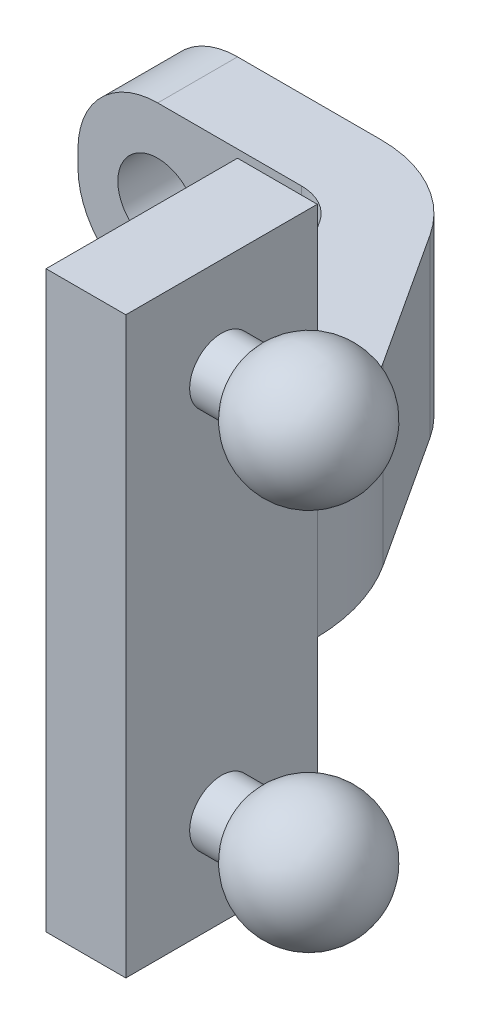
ISO-10303-21;
HEADER;
FILE_DESCRIPTION(('STEP AP214'),'2;1');
FILE_NAME('part.step','',(''),(''),'','','');
FILE_SCHEMA(('AUTOMOTIVE_DESIGN { 1 0 10303 214 1 1 1 1 }'));
ENDSEC;
DATA;
#1=APPLICATION_CONTEXT('core data for automotive mechanical design processes');
#2=APPLICATION_PROTOCOL_DEFINITION('international standard','automotive_design',2000,#1);
#3=PRODUCT_CONTEXT('',#1,'mechanical');
#4=PRODUCT('Part','Part','',(#3));
#5=PRODUCT_RELATED_PRODUCT_CATEGORY('part','',(#4));
#6=PRODUCT_DEFINITION_FORMATION('','',#4);
#7=PRODUCT_DEFINITION_CONTEXT('part definition',#1,'design');
#8=PRODUCT_DEFINITION('design','',#6,#7);
#9=PRODUCT_DEFINITION_SHAPE('','',#8);
#10=(LENGTH_UNIT() NAMED_UNIT(*) SI_UNIT(.MILLI.,.METRE.));
#11=(NAMED_UNIT(*) PLANE_ANGLE_UNIT() SI_UNIT($,.RADIAN.));
#12=(NAMED_UNIT(*) SI_UNIT($,.STERADIAN.) SOLID_ANGLE_UNIT());
#13=UNCERTAINTY_MEASURE_WITH_UNIT(LENGTH_MEASURE(1.E-05),#10,'distance_accuracy_value','');
#14=(GEOMETRIC_REPRESENTATION_CONTEXT(3) GLOBAL_UNCERTAINTY_ASSIGNED_CONTEXT((#13)) GLOBAL_UNIT_ASSIGNED_CONTEXT((#10,
#11,#12)) REPRESENTATION_CONTEXT('',''));
#15=CARTESIAN_POINT('',(0.,0.,0.));
#16=DIRECTION('',(0.,0.,1.));
#17=DIRECTION('',(1.,0.,0.));
#18=AXIS2_PLACEMENT_3D('',#15,#16,#17);
#19=CARTESIAN_POINT('',(0.,2.75,0.));
#20=DIRECTION('',(1.,0.,0.));
#21=DIRECTION('',(0.,0.,-1.));
#22=AXIS2_PLACEMENT_3D('',#19,#20,#21);
#23=PLANE('',#22);
#24=DIRECTION('',(0.,-1.,0.));
#25=VECTOR('',#24,1.);
#26=CARTESIAN_POINT('',(0.,2.75,0.));
#27=LINE('',#26,#25);
#28=CARTESIAN_POINT('',(0.,0.25,0.));
#29=VERTEX_POINT('',#28);
#30=CARTESIAN_POINT('',(0.,-0.25,0.));
#31=VERTEX_POINT('',#30);
#32=EDGE_CURVE('E244',#29,#31,#27,.T.);
#33=ORIENTED_EDGE('',*,*,#32,.T.);
#34=DIRECTION('',(0.,0.,1.));
#35=VECTOR('',#34,1.);
#36=CARTESIAN_POINT('',(0.,-0.25,2.5));
#37=LINE('',#36,#35);
#38=CARTESIAN_POINT('',(0.,-0.25,2.5));
#39=VERTEX_POINT('',#38);
#40=EDGE_CURVE('E287',#31,#39,#37,.T.);
#41=ORIENTED_EDGE('',*,*,#40,.T.);
#42=DIRECTION('',(0.,-1.,0.));
#43=VECTOR('',#42,1.);
#44=CARTESIAN_POINT('',(0.,2.75,2.5));
#45=LINE('',#44,#43);
#46=CARTESIAN_POINT('',(0.,0.25,2.5));
#47=VERTEX_POINT('',#46);
#48=EDGE_CURVE('E282',#47,#39,#45,.T.);
#49=ORIENTED_EDGE('',*,*,#48,.F.);
#50=DIRECTION('',(0.,0.,1.));
#51=VECTOR('',#50,1.);
#52=CARTESIAN_POINT('',(0.,0.25,0.));
#53=LINE('',#52,#51);
#54=EDGE_CURVE('E285',#47,#29,#53,.F.);
#55=ORIENTED_EDGE('',*,*,#54,.T.);
#56=EDGE_LOOP('',(#33,#41,#49,#55));
#57=FACE_BOUND('',#56,.T.);
#58=ADVANCED_FACE('F39',(#57),#23,.F.);
#59=CARTESIAN_POINT('',(0.,2.75,2.5));
#60=DIRECTION('',(0.,0.,-1.));
#61=DIRECTION('',(-1.,0.,0.));
#62=AXIS2_PLACEMENT_3D('',#59,#60,#61);
#63=PLANE('',#62);
#64=CARTESIAN_POINT('',(2.5,0.,2.5));
#65=DIRECTION('',(0.,0.,-1.));
#66=DIRECTION('',(-1.,0.,0.));
#67=AXIS2_PLACEMENT_3D('',#64,#65,#66);
#68=CIRCLE('',#67,1.25);
#69=CARTESIAN_POINT('',(1.25,0.,2.5));
#70=VERTEX_POINT('',#69);
#71=EDGE_CURVE('E222',#70,#70,#68,.T.);
#72=ORIENTED_EDGE('',*,*,#71,.T.);
#73=EDGE_LOOP('',(#72));
#74=FACE_BOUND('',#73,.T.);
#75=ORIENTED_EDGE('',*,*,#48,.T.);
#76=CARTESIAN_POINT('',(2.5,-0.25,2.5));
#77=DIRECTION('',(0.,0.,-1.));
#78=DIRECTION('',(-1.,0.,0.));
#79=AXIS2_PLACEMENT_3D('',#76,#77,#78);
#80=CIRCLE('',#79,2.5);
#81=CARTESIAN_POINT('',(2.5,-2.75,2.5));
#82=VERTEX_POINT('',#81);
#83=EDGE_CURVE('E292',#39,#82,#80,.F.);
#84=ORIENTED_EDGE('',*,*,#83,.T.);
#85=DIRECTION('',(1.,0.,0.));
#86=VECTOR('',#85,1.);
#87=CARTESIAN_POINT('',(0.,-2.75,2.5));
#88=LINE('',#87,#86);
#89=CARTESIAN_POINT('',(7.,-2.75,2.5));
#90=VERTEX_POINT('',#89);
#91=EDGE_CURVE('E225',#82,#90,#88,.T.);
#92=ORIENTED_EDGE('',*,*,#91,.T.);
#93=DIRECTION('',(0.,-1.,0.));
#94=VECTOR('',#93,1.);
#95=CARTESIAN_POINT('',(7.,2.75,2.5));
#96=LINE('',#95,#94);
#97=CARTESIAN_POINT('',(7.,2.75,2.5));
#98=VERTEX_POINT('',#97);
#99=EDGE_CURVE('E279',#98,#90,#96,.T.);
#100=ORIENTED_EDGE('',*,*,#99,.F.);
#101=DIRECTION('',(1.,0.,0.));
#102=VECTOR('',#101,1.);
#103=CARTESIAN_POINT('',(0.,2.75,2.5));
#104=LINE('',#103,#102);
#105=CARTESIAN_POINT('',(2.5,2.75,2.5));
#106=VERTEX_POINT('',#105);
#107=EDGE_CURVE('E226',#106,#98,#104,.T.);
#108=ORIENTED_EDGE('',*,*,#107,.F.);
#109=CARTESIAN_POINT('',(2.5,0.25,2.5));
#110=DIRECTION('',(0.,0.,-1.));
#111=DIRECTION('',(-1.,0.,0.));
#112=AXIS2_PLACEMENT_3D('',#109,#110,#111);
#113=CIRCLE('',#112,2.5);
#114=EDGE_CURVE('E290',#106,#47,#113,.F.);
#115=ORIENTED_EDGE('',*,*,#114,.T.);
#116=EDGE_LOOP('',(#75,#84,#92,#100,#108,#115));
#117=FACE_BOUND('',#116,.T.);
#118=ADVANCED_FACE('F376',(#74,#117),#63,.F.);
#119=CARTESIAN_POINT('',(7.,2.75,4.));
#120=DIRECTION('',(0.,-1.,0.));
#121=DIRECTION('',(0.,0.,-1.));
#122=AXIS2_PLACEMENT_3D('',#119,#120,#121);
#123=CYLINDRICAL_SURFACE('',#122,1.5);
#124=CARTESIAN_POINT('',(7.,-2.75,4.));
#125=DIRECTION('',(0.,-1.,0.));
#126=DIRECTION('',(0.,0.,-1.));
#127=AXIS2_PLACEMENT_3D('',#124,#125,#126);
#128=CIRCLE('',#127,1.5);
#129=CARTESIAN_POINT('',(8.25754577081105,-2.75,3.18233342106012));
#130=VERTEX_POINT('',#129);
#131=EDGE_CURVE('E246',#90,#130,#128,.T.);
#132=ORIENTED_EDGE('',*,*,#131,.T.);
#133=DIRECTION('',(0.,-1.,0.));
#134=VECTOR('',#133,1.);
#135=CARTESIAN_POINT('',(8.25754577081105,2.75,3.18233342106012));
#136=LINE('',#135,#134);
#137=CARTESIAN_POINT('',(8.25754577081105,2.75,3.18233342106012));
#138=VERTEX_POINT('',#137);
#139=EDGE_CURVE('E276',#138,#130,#136,.T.);
#140=ORIENTED_EDGE('',*,*,#139,.F.);
#141=CARTESIAN_POINT('',(7.,2.75,4.));
#142=DIRECTION('',(0.,-1.,0.));
#143=DIRECTION('',(0.,0.,-1.));
#144=AXIS2_PLACEMENT_3D('',#141,#142,#143);
#145=CIRCLE('',#144,1.5);
#146=EDGE_CURVE('E228',#98,#138,#145,.T.);
#147=ORIENTED_EDGE('',*,*,#146,.F.);
#148=ORIENTED_EDGE('',*,*,#99,.T.);
#149=EDGE_LOOP('',(#132,#140,#147,#148));
#150=FACE_BOUND('',#149,.T.);
#151=ADVANCED_FACE('F383',(#150),#123,.F.);
#152=CARTESIAN_POINT('',(8.25754577081105,2.75,3.18233342106012));
#153=DIRECTION('',(0.838363847207363,0.,-0.54511105262659));
#154=DIRECTION('',(-0.54511105262659,0.,-0.838363847207363));
#155=AXIS2_PLACEMENT_3D('',#152,#153,#154);
#156=PLANE('',#155);
#157=DIRECTION('',(0.54511105262659,0.,0.838363847207363));
#158=VECTOR('',#157,1.);
#159=CARTESIAN_POINT('',(8.25754577081105,-2.75,3.18233342106012));
#160=LINE('',#159,#158);
#161=CARTESIAN_POINT('',(10.9902966016318,-2.75,7.38521921643481));
#162=VERTEX_POINT('',#161);
#163=EDGE_CURVE('E248',#130,#162,#160,.T.);
#164=ORIENTED_EDGE('',*,*,#163,.T.);
#165=DIRECTION('',(0.,-1.,0.));
#166=VECTOR('',#165,1.);
#167=CARTESIAN_POINT('',(10.9902966016318,2.75,7.38521921643481));
#168=LINE('',#167,#166);
#169=CARTESIAN_POINT('',(10.9902966016318,2.75,7.38521921643481));
#170=VERTEX_POINT('',#169);
#171=EDGE_CURVE('E273',#170,#162,#168,.T.);
#172=ORIENTED_EDGE('',*,*,#171,.F.);
#173=DIRECTION('',(0.54511105262659,0.,0.838363847207363));
#174=VECTOR('',#173,1.);
#175=CARTESIAN_POINT('',(8.25754577081105,2.75,3.18233342106012));
#176=LINE('',#175,#174);
#177=EDGE_CURVE('E231',#138,#170,#176,.T.);
#178=ORIENTED_EDGE('',*,*,#177,.F.);
#179=ORIENTED_EDGE('',*,*,#139,.T.);
#180=EDGE_LOOP('',(#164,#172,#178,#179));
#181=FACE_BOUND('',#180,.T.);
#182=ADVANCED_FACE('F410',(#181),#156,.F.);
#183=CARTESIAN_POINT('',(8.34660028365028,2.75,9.10417225516659));
#184=DIRECTION('',(0.,-1.,0.));
#185=DIRECTION('',(0.,0.,-1.));
#186=AXIS2_PLACEMENT_3D('',#183,#184,#185);
#187=CYLINDRICAL_SURFACE('',#186,3.15339971634972);
#188=CARTESIAN_POINT('',(8.34660028365028,-2.75,9.10417225516659));
#189=DIRECTION('',(0.,-1.,0.));
#190=DIRECTION('',(0.,0.,1.));
#191=AXIS2_PLACEMENT_3D('',#188,#189,#190);
#192=CIRCLE('',#191,3.15339971634972);
#193=CARTESIAN_POINT('',(11.5,-2.75,9.10417225516659));
#194=VERTEX_POINT('',#193);
#195=EDGE_CURVE('E250',#162,#194,#192,.T.);
#196=ORIENTED_EDGE('',*,*,#195,.T.);
#197=DIRECTION('',(0.,-1.,0.));
#198=VECTOR('',#197,1.);
#199=CARTESIAN_POINT('',(11.5,2.75,9.10417225516659));
#200=LINE('',#199,#198);
#201=CARTESIAN_POINT('',(11.5,2.75,9.10417225516659));
#202=VERTEX_POINT('',#201);
#203=EDGE_CURVE('E174',#202,#194,#200,.T.);
#204=ORIENTED_EDGE('',*,*,#203,.F.);
#205=CARTESIAN_POINT('',(8.34660028365028,2.75,9.10417225516659));
#206=DIRECTION('',(0.,-1.,0.));
#207=DIRECTION('',(0.,0.,1.));
#208=AXIS2_PLACEMENT_3D('',#205,#206,#207);
#209=CIRCLE('',#208,3.15339971634972);
#210=EDGE_CURVE('E233',#170,#202,#209,.T.);
#211=ORIENTED_EDGE('',*,*,#210,.F.);
#212=ORIENTED_EDGE('',*,*,#171,.T.);
#213=EDGE_LOOP('',(#196,#204,#211,#212));
#214=FACE_BOUND('',#213,.T.);
#215=ADVANCED_FACE('F330',(#214),#187,.F.);
#216=CARTESIAN_POINT('',(11.5,2.75,9.10417225516659));
#217=DIRECTION('',(1.,0.,0.));
#218=DIRECTION('',(0.,0.,-1.));
#219=AXIS2_PLACEMENT_3D('',#216,#217,#218);
#220=PLANE('',#219);
#221=ORIENTED_EDGE('',*,*,#203,.T.);
#222=DIRECTION('',(0.,0.,-1.));
#223=VECTOR('',#222,1.);
#224=CARTESIAN_POINT('',(11.5,-2.75,4.));
#225=LINE('',#224,#223);
#226=CARTESIAN_POINT('',(11.5,-2.75,9.));
#227=VERTEX_POINT('',#226);
#228=EDGE_CURVE('E301',#194,#227,#225,.T.);
#229=ORIENTED_EDGE('',*,*,#228,.T.);
#230=DIRECTION('',(0.,-1.,0.));
#231=VECTOR('',#230,1.);
#232=CARTESIAN_POINT('',(11.5,8.99999999999999,9.));
#233=LINE('',#232,#231);
#234=CARTESIAN_POINT('',(11.5,-9.,9.));
#235=VERTEX_POINT('',#234);
#236=EDGE_CURVE('E188',#227,#235,#233,.T.);
#237=ORIENTED_EDGE('',*,*,#236,.T.);
#238=DIRECTION('',(0.,0.,1.));
#239=VECTOR('',#238,1.);
#240=CARTESIAN_POINT('',(11.5,-9.,9.));
#241=LINE('',#240,#239);
#242=CARTESIAN_POINT('',(11.5,-9.,15.));
#243=VERTEX_POINT('',#242);
#244=EDGE_CURVE('E170',#235,#243,#241,.T.);
#245=ORIENTED_EDGE('',*,*,#244,.T.);
#246=DIRECTION('',(0.,-1.,0.));
#247=VECTOR('',#246,1.);
#248=CARTESIAN_POINT('',(11.5,2.75,15.));
#249=LINE('',#248,#247);
#250=CARTESIAN_POINT('',(11.5,9.,15.));
#251=VERTEX_POINT('',#250);
#252=EDGE_CURVE('E162',#251,#243,#249,.T.);
#253=ORIENTED_EDGE('',*,*,#252,.F.);
#254=DIRECTION('',(0.,0.,-1.));
#255=VECTOR('',#254,1.);
#256=CARTESIAN_POINT('',(11.5,8.99999999999999,9.));
#257=LINE('',#256,#255);
#258=CARTESIAN_POINT('',(11.5,8.99999999999999,9.));
#259=VERTEX_POINT('',#258);
#260=EDGE_CURVE('E168',#251,#259,#257,.T.);
#261=ORIENTED_EDGE('',*,*,#260,.T.);
#262=CARTESIAN_POINT('',(11.5,2.75,9.));
#263=VERTEX_POINT('',#262);
#264=EDGE_CURVE('E191',#259,#263,#233,.T.);
#265=ORIENTED_EDGE('',*,*,#264,.T.);
#266=DIRECTION('',(0.,0.,-1.));
#267=VECTOR('',#266,1.);
#268=CARTESIAN_POINT('',(11.5,2.75,4.));
#269=LINE('',#268,#267);
#270=EDGE_CURVE('E210',#202,#263,#269,.T.);
#271=ORIENTED_EDGE('',*,*,#270,.F.);
#272=EDGE_LOOP('',(#221,#229,#237,#245,#253,#261,#265,#271));
#273=FACE_BOUND('',#272,.T.);
#274=ADVANCED_FACE('F165',(#273),#220,.F.);
#275=CARTESIAN_POINT('',(11.5,2.75,15.));
#276=DIRECTION('',(0.,0.,-1.));
#277=DIRECTION('',(-1.,0.,0.));
#278=AXIS2_PLACEMENT_3D('',#275,#276,#277);
#279=PLANE('',#278);
#280=ORIENTED_EDGE('',*,*,#252,.T.);
#281=DIRECTION('',(-1.,0.,0.));
#282=VECTOR('',#281,1.);
#283=CARTESIAN_POINT('',(32.9736659610103,-9.,15.));
#284=LINE('',#283,#282);
#285=CARTESIAN_POINT('',(14.,-9.,15.));
#286=VERTEX_POINT('',#285);
#287=EDGE_CURVE('E201',#286,#243,#284,.T.);
#288=ORIENTED_EDGE('',*,*,#287,.F.);
#289=DIRECTION('',(0.,-1.,0.));
#290=VECTOR('',#289,1.);
#291=CARTESIAN_POINT('',(14.,2.75,15.));
#292=LINE('',#291,#290);
#293=CARTESIAN_POINT('',(14.,9.,15.));
#294=VERTEX_POINT('',#293);
#295=EDGE_CURVE('E175',#294,#286,#292,.T.);
#296=ORIENTED_EDGE('',*,*,#295,.F.);
#297=DIRECTION('',(-1.,0.,0.));
#298=VECTOR('',#297,1.);
#299=CARTESIAN_POINT('',(32.9736659610103,9.,15.));
#300=LINE('',#299,#298);
#301=EDGE_CURVE('E178',#294,#251,#300,.T.);
#302=ORIENTED_EDGE('',*,*,#301,.T.);
#303=EDGE_LOOP('',(#280,#288,#296,#302));
#304=FACE_BOUND('',#303,.T.);
#305=ADVANCED_FACE('F179',(#304),#279,.F.);
#306=CARTESIAN_POINT('',(14.,2.75,9.10417225516659));
#307=DIRECTION('',(-1.,0.,0.));
#308=DIRECTION('',(0.,0.,1.));
#309=AXIS2_PLACEMENT_3D('',#306,#307,#308);
#310=PLANE('',#309);
#311=CARTESIAN_POINT('',(14.,-5.99999999999999,12.));
#312=DIRECTION('',(-1.,0.,0.));
#313=DIRECTION('',(0.,0.,-1.));
#314=AXIS2_PLACEMENT_3D('',#311,#312,#313);
#315=CIRCLE('',#314,1.);
#316=CARTESIAN_POINT('',(14.,-5.99999999999999,11.));
#317=VERTEX_POINT('',#316);
#318=EDGE_CURVE('E194',#317,#317,#315,.T.);
#319=ORIENTED_EDGE('',*,*,#318,.T.);
#320=EDGE_LOOP('',(#319));
#321=FACE_BOUND('',#320,.T.);
#322=CARTESIAN_POINT('',(14.,5.99999999999999,12.));
#323=DIRECTION('',(-1.,0.,0.));
#324=DIRECTION('',(0.,0.,1.));
#325=AXIS2_PLACEMENT_3D('',#322,#323,#324);
#326=CIRCLE('',#325,1.);
#327=CARTESIAN_POINT('',(14.,5.99999999999999,13.));
#328=VERTEX_POINT('',#327);
#329=EDGE_CURVE('E11',#328,#328,#326,.F.);
#330=ORIENTED_EDGE('',*,*,#329,.F.);
#331=EDGE_LOOP('',(#330));
#332=FACE_BOUND('',#331,.T.);
#333=ORIENTED_EDGE('',*,*,#295,.T.);
#334=DIRECTION('',(0.,0.,-1.));
#335=VECTOR('',#334,1.);
#336=CARTESIAN_POINT('',(14.,-9.,8.99999999999999));
#337=LINE('',#336,#335);
#338=CARTESIAN_POINT('',(14.,-9.,9.));
#339=VERTEX_POINT('',#338);
#340=EDGE_CURVE('E197',#286,#339,#337,.T.);
#341=ORIENTED_EDGE('',*,*,#340,.T.);
#342=DIRECTION('',(0.,1.,0.));
#343=VECTOR('',#342,1.);
#344=CARTESIAN_POINT('',(14.,8.99999999999999,9.));
#345=LINE('',#344,#343);
#346=CARTESIAN_POINT('',(14.,8.99999999999999,9.));
#347=VERTEX_POINT('',#346);
#348=EDGE_CURVE('E203',#339,#347,#345,.T.);
#349=ORIENTED_EDGE('',*,*,#348,.T.);
#350=DIRECTION('',(0.,0.,1.));
#351=VECTOR('',#350,1.);
#352=CARTESIAN_POINT('',(14.,8.99999999999999,8.99999999999999));
#353=LINE('',#352,#351);
#354=EDGE_CURVE('E208',#347,#294,#353,.T.);
#355=ORIENTED_EDGE('',*,*,#354,.T.);
#356=EDGE_LOOP('',(#333,#341,#349,#355));
#357=FACE_BOUND('',#356,.T.);
#358=ADVANCED_FACE('F356',(#321,#332,#357),#310,.F.);
#359=CARTESIAN_POINT('',(8.34660028365028,2.75,9.10417225516659));
#360=DIRECTION('',(0.,-1.,0.));
#361=DIRECTION('',(0.,0.,-1.));
#362=AXIS2_PLACEMENT_3D('',#359,#360,#361);
#363=CYLINDRICAL_SURFACE('',#362,5.65339971634972);
#364=CARTESIAN_POINT('',(8.34660028365028,2.75,9.10417225516659));
#365=DIRECTION('',(0.,1.,0.));
#366=DIRECTION('',(0.,0.,-1.));
#367=AXIS2_PLACEMENT_3D('',#364,#365,#366);
#368=CIRCLE('',#367,5.65339971634972);
#369=CARTESIAN_POINT('',(13.9990401545447,2.75,9.));
#370=VERTEX_POINT('',#369);
#371=CARTESIAN_POINT('',(13.0862062196502,2.75,6.02244158486833));
#372=VERTEX_POINT('',#371);
#373=EDGE_CURVE('E236',#370,#372,#368,.T.);
#374=ORIENTED_EDGE('',*,*,#373,.F.);
#375=DIRECTION('',(0.,-1.,0.));
#376=VECTOR('',#375,1.);
#377=CARTESIAN_POINT('',(13.9990401545447,2.75,9.));
#378=LINE('',#377,#376);
#379=CARTESIAN_POINT('',(13.9990401545447,-2.75,9.));
#380=VERTEX_POINT('',#379);
#381=EDGE_CURVE('E213',#370,#380,#378,.T.);
#382=ORIENTED_EDGE('',*,*,#381,.T.);
#383=CARTESIAN_POINT('',(8.34660028365028,-2.75,9.10417225516659));
#384=DIRECTION('',(0.,1.,0.));
#385=DIRECTION('',(0.,0.,-1.));
#386=AXIS2_PLACEMENT_3D('',#383,#384,#385);
#387=CIRCLE('',#386,5.65339971634972);
#388=CARTESIAN_POINT('',(13.0862062196502,-2.75,6.02244158486833));
#389=VERTEX_POINT('',#388);
#390=EDGE_CURVE('E253',#380,#389,#387,.T.);
#391=ORIENTED_EDGE('',*,*,#390,.T.);
#392=DIRECTION('',(0.,-1.,0.));
#393=VECTOR('',#392,1.);
#394=CARTESIAN_POINT('',(13.0862062196502,2.75,6.02244158486833));
#395=LINE('',#394,#393);
#396=EDGE_CURVE('E268',#372,#389,#395,.T.);
#397=ORIENTED_EDGE('',*,*,#396,.F.);
#398=EDGE_LOOP('',(#374,#382,#391,#397));
#399=FACE_BOUND('',#398,.T.);
#400=ADVANCED_FACE('F309',(#399),#363,.T.);
#401=CARTESIAN_POINT('',(10.3534553888295,2.75,1.81955578949364));
#402=DIRECTION('',(-0.838363847207363,0.,0.54511105262659));
#403=DIRECTION('',(0.54511105262659,0.,0.838363847207363));
#404=AXIS2_PLACEMENT_3D('',#401,#402,#403);
#405=PLANE('',#404);
#406=DIRECTION('',(-0.54511105262659,0.,-0.838363847207363));
#407=VECTOR('',#406,1.);
#408=CARTESIAN_POINT('',(10.3534553888295,-2.75,1.81955578949364));
#409=LINE('',#408,#407);
#410=CARTESIAN_POINT('',(10.3534553888295,-2.75,1.81955578949364));
#411=VERTEX_POINT('',#410);
#412=EDGE_CURVE('E255',#389,#411,#409,.T.);
#413=ORIENTED_EDGE('',*,*,#412,.T.);
#414=DIRECTION('',(0.,-1.,0.));
#415=VECTOR('',#414,1.);
#416=CARTESIAN_POINT('',(10.3534553888295,2.75,1.81955578949364));
#417=LINE('',#416,#415);
#418=CARTESIAN_POINT('',(10.3534553888295,2.75,1.81955578949364));
#419=VERTEX_POINT('',#418);
#420=EDGE_CURVE('E265',#419,#411,#417,.T.);
#421=ORIENTED_EDGE('',*,*,#420,.F.);
#422=DIRECTION('',(-0.54511105262659,0.,-0.838363847207363));
#423=VECTOR('',#422,1.);
#424=CARTESIAN_POINT('',(10.3534553888295,2.75,1.81955578949364));
#425=LINE('',#424,#423);
#426=EDGE_CURVE('E238',#372,#419,#425,.T.);
#427=ORIENTED_EDGE('',*,*,#426,.F.);
#428=ORIENTED_EDGE('',*,*,#396,.T.);
#429=EDGE_LOOP('',(#413,#421,#427,#428));
#430=FACE_BOUND('',#429,.T.);
#431=ADVANCED_FACE('F316',(#430),#405,.F.);
#432=CARTESIAN_POINT('',(7.,2.75,4.));
#433=DIRECTION('',(0.,-1.,0.));
#434=DIRECTION('',(0.,0.,-1.));
#435=AXIS2_PLACEMENT_3D('',#432,#433,#434);
#436=CYLINDRICAL_SURFACE('',#435,4.);
#437=CARTESIAN_POINT('',(7.,-2.75,4.));
#438=DIRECTION('',(0.,1.,0.));
#439=DIRECTION('',(0.,0.,-1.));
#440=AXIS2_PLACEMENT_3D('',#437,#438,#439);
#441=CIRCLE('',#440,4.);
#442=CARTESIAN_POINT('',(7.,-2.75,0.));
#443=VERTEX_POINT('',#442);
#444=EDGE_CURVE('E257',#411,#443,#441,.T.);
#445=ORIENTED_EDGE('',*,*,#444,.T.);
#446=DIRECTION('',(0.,-1.,0.));
#447=VECTOR('',#446,1.);
#448=CARTESIAN_POINT('',(7.,2.75,0.));
#449=LINE('',#448,#447);
#450=CARTESIAN_POINT('',(7.,2.75,0.));
#451=VERTEX_POINT('',#450);
#452=EDGE_CURVE('E262',#451,#443,#449,.T.);
#453=ORIENTED_EDGE('',*,*,#452,.F.);
#454=CARTESIAN_POINT('',(7.,2.75,4.));
#455=DIRECTION('',(0.,1.,0.));
#456=DIRECTION('',(0.,0.,-1.));
#457=AXIS2_PLACEMENT_3D('',#454,#455,#456);
#458=CIRCLE('',#457,4.);
#459=EDGE_CURVE('E240',#419,#451,#458,.T.);
#460=ORIENTED_EDGE('',*,*,#459,.F.);
#461=ORIENTED_EDGE('',*,*,#420,.T.);
#462=EDGE_LOOP('',(#445,#453,#460,#461));
#463=FACE_BOUND('',#462,.T.);
#464=ADVANCED_FACE('F320',(#463),#436,.T.);
#465=CARTESIAN_POINT('',(0.,2.75,0.));
#466=DIRECTION('',(0.,0.,1.));
#467=DIRECTION('',(1.,0.,0.));
#468=AXIS2_PLACEMENT_3D('',#465,#466,#467);
#469=PLANE('',#468);
#470=CARTESIAN_POINT('',(2.5,0.,0.));
#471=DIRECTION('',(0.,0.,-1.));
#472=DIRECTION('',(-1.,0.,0.));
#473=AXIS2_PLACEMENT_3D('',#470,#471,#472);
#474=CIRCLE('',#473,1.25);
#475=CARTESIAN_POINT('',(1.25,0.,0.));
#476=VERTEX_POINT('',#475);
#477=EDGE_CURVE('E219',#476,#476,#474,.T.);
#478=ORIENTED_EDGE('',*,*,#477,.F.);
#479=EDGE_LOOP('',(#478));
#480=FACE_BOUND('',#479,.T.);
#481=DIRECTION('',(-1.,0.,0.));
#482=VECTOR('',#481,1.);
#483=CARTESIAN_POINT('',(0.,-2.75,0.));
#484=LINE('',#483,#482);
#485=CARTESIAN_POINT('',(2.5,-2.75,0.));
#486=VERTEX_POINT('',#485);
#487=EDGE_CURVE('E229',#443,#486,#484,.T.);
#488=ORIENTED_EDGE('',*,*,#487,.T.);
#489=CARTESIAN_POINT('',(2.5,-0.25,0.));
#490=DIRECTION('',(0.,0.,1.));
#491=DIRECTION('',(1.,0.,0.));
#492=AXIS2_PLACEMENT_3D('',#489,#490,#491);
#493=CIRCLE('',#492,2.5);
#494=EDGE_CURVE('E296',#486,#31,#493,.F.);
#495=ORIENTED_EDGE('',*,*,#494,.T.);
#496=ORIENTED_EDGE('',*,*,#32,.F.);
#497=CARTESIAN_POINT('',(2.5,0.25,0.));
#498=DIRECTION('',(0.,0.,1.));
#499=DIRECTION('',(1.,0.,0.));
#500=AXIS2_PLACEMENT_3D('',#497,#498,#499);
#501=CIRCLE('',#500,2.5);
#502=CARTESIAN_POINT('',(2.5,2.75,0.));
#503=VERTEX_POINT('',#502);
#504=EDGE_CURVE('E54',#29,#503,#501,.F.);
#505=ORIENTED_EDGE('',*,*,#504,.T.);
#506=DIRECTION('',(-1.,0.,0.));
#507=VECTOR('',#506,1.);
#508=CARTESIAN_POINT('',(0.,2.75,0.));
#509=LINE('',#508,#507);
#510=EDGE_CURVE('E242',#451,#503,#509,.T.);
#511=ORIENTED_EDGE('',*,*,#510,.F.);
#512=ORIENTED_EDGE('',*,*,#452,.T.);
#513=EDGE_LOOP('',(#488,#495,#496,#505,#511,#512));
#514=FACE_BOUND('',#513,.T.);
#515=ADVANCED_FACE('F400',(#480,#514),#469,.F.);
#516=CARTESIAN_POINT('',(7.,2.75,4.));
#517=DIRECTION('',(0.,-1.,0.));
#518=DIRECTION('',(0.,0.,-1.));
#519=AXIS2_PLACEMENT_3D('',#516,#517,#518);
#520=PLANE('',#519);
#521=ORIENTED_EDGE('',*,*,#270,.T.);
#522=DIRECTION('',(1.,0.,0.));
#523=VECTOR('',#522,1.);
#524=CARTESIAN_POINT('',(7.,2.75,9.));
#525=LINE('',#524,#523);
#526=EDGE_CURVE('E216',#263,#370,#525,.T.);
#527=ORIENTED_EDGE('',*,*,#526,.T.);
#528=ORIENTED_EDGE('',*,*,#373,.T.);
#529=ORIENTED_EDGE('',*,*,#426,.T.);
#530=ORIENTED_EDGE('',*,*,#459,.T.);
#531=ORIENTED_EDGE('',*,*,#510,.T.);
#532=DIRECTION('',(0.,0.,1.));
#533=VECTOR('',#532,1.);
#534=CARTESIAN_POINT('',(2.5,2.75,4.));
#535=LINE('',#534,#533);
#536=EDGE_CURVE('E298',#503,#106,#535,.T.);
#537=ORIENTED_EDGE('',*,*,#536,.T.);
#538=ORIENTED_EDGE('',*,*,#107,.T.);
#539=ORIENTED_EDGE('',*,*,#146,.T.);
#540=ORIENTED_EDGE('',*,*,#177,.T.);
#541=ORIENTED_EDGE('',*,*,#210,.T.);
#542=EDGE_LOOP('',(#521,#527,#528,#529,#530,#531,#537,#538,#539,#540,#541));
#543=FACE_BOUND('',#542,.T.);
#544=ADVANCED_FACE('F323',(#543),#520,.F.);
#545=CARTESIAN_POINT('',(7.,-2.75,4.));
#546=DIRECTION('',(0.,-1.,0.));
#547=DIRECTION('',(0.,0.,-1.));
#548=AXIS2_PLACEMENT_3D('',#545,#546,#547);
#549=PLANE('',#548);
#550=DIRECTION('',(1.,0.,0.));
#551=VECTOR('',#550,1.);
#552=CARTESIAN_POINT('',(7.,-2.75,9.00000000000001));
#553=LINE('',#552,#551);
#554=EDGE_CURVE('E47',#227,#380,#553,.T.);
#555=ORIENTED_EDGE('',*,*,#554,.F.);
#556=ORIENTED_EDGE('',*,*,#228,.F.);
#557=ORIENTED_EDGE('',*,*,#195,.F.);
#558=ORIENTED_EDGE('',*,*,#163,.F.);
#559=ORIENTED_EDGE('',*,*,#131,.F.);
#560=ORIENTED_EDGE('',*,*,#91,.F.);
#561=DIRECTION('',(0.,0.,1.));
#562=VECTOR('',#561,1.);
#563=CARTESIAN_POINT('',(2.5,-2.75,0.));
#564=LINE('',#563,#562);
#565=EDGE_CURVE('E62',#82,#486,#564,.F.);
#566=ORIENTED_EDGE('',*,*,#565,.T.);
#567=ORIENTED_EDGE('',*,*,#487,.F.);
#568=ORIENTED_EDGE('',*,*,#444,.F.);
#569=ORIENTED_EDGE('',*,*,#412,.F.);
#570=ORIENTED_EDGE('',*,*,#390,.F.);
#571=EDGE_LOOP('',(#555,#556,#557,#558,#559,#560,#566,#567,#568,#569,#570));
#572=FACE_BOUND('',#571,.T.);
#573=ADVANCED_FACE('F312',(#572),#549,.T.);
#574=CARTESIAN_POINT('',(2.5,0.,10.));
#575=DIRECTION('',(0.,0.,-1.));
#576=DIRECTION('',(-1.,0.,0.));
#577=AXIS2_PLACEMENT_3D('',#574,#575,#576);
#578=CYLINDRICAL_SURFACE('',#577,1.25);
#579=ORIENTED_EDGE('',*,*,#477,.T.);
#580=EDGE_LOOP('',(#579));
#581=FACE_BOUND('',#580,.T.);
#582=ORIENTED_EDGE('',*,*,#71,.F.);
#583=EDGE_LOOP('',(#582));
#584=FACE_BOUND('',#583,.T.);
#585=ADVANCED_FACE('F389',(#581,#584),#578,.F.);
#586=CARTESIAN_POINT('',(2.5,-0.25,0.));
#587=DIRECTION('',(0.,0.,-1.));
#588=DIRECTION('',(-1.,0.,0.));
#589=AXIS2_PLACEMENT_3D('',#586,#587,#588);
#590=CYLINDRICAL_SURFACE('',#589,2.5);
#591=ORIENTED_EDGE('',*,*,#494,.F.);
#592=ORIENTED_EDGE('',*,*,#565,.F.);
#593=ORIENTED_EDGE('',*,*,#83,.F.);
#594=ORIENTED_EDGE('',*,*,#40,.F.);
#595=EDGE_LOOP('',(#591,#592,#593,#594));
#596=FACE_BOUND('',#595,.T.);
#597=ADVANCED_FACE('F387',(#596),#590,.T.);
#598=CARTESIAN_POINT('',(2.5,0.25,4.));
#599=DIRECTION('',(0.,0.,1.));
#600=DIRECTION('',(1.,0.,0.));
#601=AXIS2_PLACEMENT_3D('',#598,#599,#600);
#602=CYLINDRICAL_SURFACE('',#601,2.5);
#603=ORIENTED_EDGE('',*,*,#504,.F.);
#604=ORIENTED_EDGE('',*,*,#54,.F.);
#605=ORIENTED_EDGE('',*,*,#114,.F.);
#606=ORIENTED_EDGE('',*,*,#536,.F.);
#607=EDGE_LOOP('',(#603,#604,#605,#606));
#608=FACE_BOUND('',#607,.T.);
#609=ADVANCED_FACE('F41',(#608),#602,.T.);
#610=CARTESIAN_POINT('',(32.9736659610103,8.99999999999999,8.99999999999999));
#611=DIRECTION('',(0.,0.,-1.));
#612=DIRECTION('',(-1.,0.,0.));
#613=AXIS2_PLACEMENT_3D('',#610,#611,#612);
#614=PLANE('',#613);
#615=ORIENTED_EDGE('',*,*,#526,.F.);
#616=ORIENTED_EDGE('',*,*,#264,.F.);
#617=DIRECTION('',(-1.,0.,0.));
#618=VECTOR('',#617,1.);
#619=CARTESIAN_POINT('',(32.9736659610103,8.99999999999999,8.99999999999999));
#620=LINE('',#619,#618);
#621=EDGE_CURVE('E183',#347,#259,#620,.T.);
#622=ORIENTED_EDGE('',*,*,#621,.F.);
#623=ORIENTED_EDGE('',*,*,#348,.F.);
#624=DIRECTION('',(-1.,0.,0.));
#625=VECTOR('',#624,1.);
#626=CARTESIAN_POINT('',(32.9736659610103,-9.,8.99999999999999));
#627=LINE('',#626,#625);
#628=EDGE_CURVE('E204',#339,#235,#627,.T.);
#629=ORIENTED_EDGE('',*,*,#628,.T.);
#630=ORIENTED_EDGE('',*,*,#236,.F.);
#631=ORIENTED_EDGE('',*,*,#554,.T.);
#632=ORIENTED_EDGE('',*,*,#381,.F.);
#633=EDGE_LOOP('',(#615,#616,#622,#623,#629,#630,#631,#632));
#634=FACE_BOUND('',#633,.T.);
#635=ADVANCED_FACE('F305',(#634),#614,.T.);
#636=CARTESIAN_POINT('',(32.9736659610103,-9.,8.99999999999999));
#637=DIRECTION('',(0.,-1.,0.));
#638=DIRECTION('',(0.,0.,-1.));
#639=AXIS2_PLACEMENT_3D('',#636,#637,#638);
#640=PLANE('',#639);
#641=ORIENTED_EDGE('',*,*,#340,.F.);
#642=ORIENTED_EDGE('',*,*,#287,.T.);
#643=ORIENTED_EDGE('',*,*,#244,.F.);
#644=ORIENTED_EDGE('',*,*,#628,.F.);
#645=EDGE_LOOP('',(#641,#642,#643,#644));
#646=FACE_BOUND('',#645,.T.);
#647=ADVANCED_FACE('F338',(#646),#640,.T.);
#648=CARTESIAN_POINT('',(32.9736659610103,8.99999999999999,8.99999999999999));
#649=DIRECTION('',(0.,1.,0.));
#650=DIRECTION('',(0.,0.,1.));
#651=AXIS2_PLACEMENT_3D('',#648,#649,#650);
#652=PLANE('',#651);
#653=ORIENTED_EDGE('',*,*,#354,.F.);
#654=ORIENTED_EDGE('',*,*,#621,.T.);
#655=ORIENTED_EDGE('',*,*,#260,.F.);
#656=ORIENTED_EDGE('',*,*,#301,.F.);
#657=EDGE_LOOP('',(#653,#654,#655,#656));
#658=FACE_BOUND('',#657,.T.);
#659=ADVANCED_FACE('F185',(#658),#652,.T.);
#660=CARTESIAN_POINT('',(15.,5.99999999999999,12.));
#661=DIRECTION('',(-1.,0.,0.));
#662=DIRECTION('',(0.,0.,1.));
#663=AXIS2_PLACEMENT_3D('',#660,#661,#662);
#664=CYLINDRICAL_SURFACE('',#663,1.);
#665=CARTESIAN_POINT('',(15.,5.99999999999999,12.));
#666=DIRECTION('',(1.,0.,0.));
#667=DIRECTION('',(0.,0.,-1.));
#668=AXIS2_PLACEMENT_3D('',#665,#666,#667);
#669=CIRCLE('',#668,1.);
#670=CARTESIAN_POINT('',(15.,5.99999999999999,11.));
#671=VERTEX_POINT('',#670);
#672=EDGE_CURVE('E189',#671,#671,#669,.T.);
#673=ORIENTED_EDGE('',*,*,#672,.F.);
#674=EDGE_LOOP('',(#673));
#675=FACE_BOUND('',#674,.T.);
#676=ORIENTED_EDGE('',*,*,#329,.T.);
#677=EDGE_LOOP('',(#676));
#678=FACE_BOUND('',#677,.T.);
#679=ADVANCED_FACE('F362',(#675,#678),#664,.T.);
#680=CARTESIAN_POINT('',(16.7320508075689,5.99999999999999,12.));
#681=DIRECTION('',(-1.,0.,0.));
#682=DIRECTION('',(0.,1.,0.));
#683=AXIS2_PLACEMENT_3D('',#680,#681,#682);
#684=SPHERICAL_SURFACE('',#683,2.);
#685=ORIENTED_EDGE('',*,*,#672,.T.);
#686=EDGE_LOOP('',(#685));
#687=FACE_BOUND('',#686,.T.);
#688=ADVANCED_FACE('F352',(#687),#684,.T.);
#689=CARTESIAN_POINT('',(15.,-5.99999999999999,12.));
#690=DIRECTION('',(-1.,0.,0.));
#691=DIRECTION('',(0.,0.,1.));
#692=AXIS2_PLACEMENT_3D('',#689,#690,#691);
#693=CYLINDRICAL_SURFACE('',#692,1.);
#694=CARTESIAN_POINT('',(15.,-5.99999999999999,12.));
#695=DIRECTION('',(1.,0.,0.));
#696=DIRECTION('',(0.,0.,1.));
#697=AXIS2_PLACEMENT_3D('',#694,#695,#696);
#698=CIRCLE('',#697,1.);
#699=CARTESIAN_POINT('',(15.,-5.99999999999999,13.));
#700=VERTEX_POINT('',#699);
#701=EDGE_CURVE('E343',#700,#700,#698,.T.);
#702=ORIENTED_EDGE('',*,*,#701,.F.);
#703=EDGE_LOOP('',(#702));
#704=FACE_BOUND('',#703,.T.);
#705=ORIENTED_EDGE('',*,*,#318,.F.);
#706=EDGE_LOOP('',(#705));
#707=FACE_BOUND('',#706,.T.);
#708=ADVANCED_FACE('F349',(#704,#707),#693,.T.);
#709=CARTESIAN_POINT('',(16.7320508075689,-5.99999999999999,12.));
#710=DIRECTION('',(-1.,0.,0.));
#711=DIRECTION('',(0.,-1.,0.));
#712=AXIS2_PLACEMENT_3D('',#709,#710,#711);
#713=SPHERICAL_SURFACE('',#712,2.);
#714=ORIENTED_EDGE('',*,*,#701,.T.);
#715=EDGE_LOOP('',(#714));
#716=FACE_BOUND('',#715,.T.);
#717=ADVANCED_FACE('F347',(#716),#713,.T.);
#718=CLOSED_SHELL('',(#58,#118,#151,#182,#215,#274,#305,#358,#400,#431,#464,#515,#544,#573,#585,
#597,#609,#635,#647,#659,#679,#688,#708,#717));
#719=MANIFOLD_SOLID_BREP('B2',#718);
#720=ADVANCED_BREP_SHAPE_REPRESENTATION('',(#18,#719),#14);
#721=SHAPE_DEFINITION_REPRESENTATION(#9,#720);
ENDSEC;
END-ISO-10303-21;
